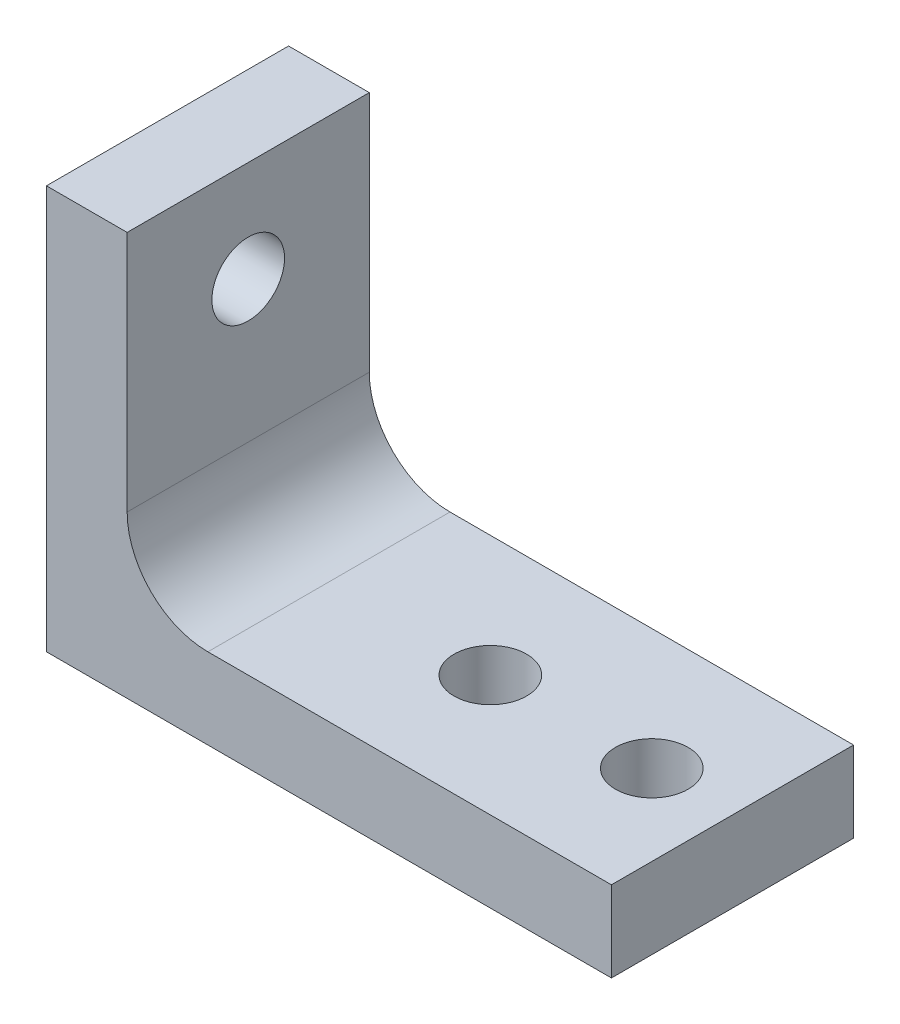
ISO-10303-21;
HEADER;
FILE_DESCRIPTION(('STEP AP214'),'2;1');
FILE_NAME('part.step','',(''),(''),'','','');
FILE_SCHEMA(('AUTOMOTIVE_DESIGN { 1 0 10303 214 1 1 1 1 }'));
ENDSEC;
DATA;
#1=APPLICATION_CONTEXT('core data for automotive mechanical design processes');
#2=APPLICATION_PROTOCOL_DEFINITION('international standard','automotive_design',2000,#1);
#3=PRODUCT_CONTEXT('',#1,'mechanical');
#4=PRODUCT('Part','Part','',(#3));
#5=PRODUCT_RELATED_PRODUCT_CATEGORY('part','',(#4));
#6=PRODUCT_DEFINITION_FORMATION('','',#4);
#7=PRODUCT_DEFINITION_CONTEXT('part definition',#1,'design');
#8=PRODUCT_DEFINITION('design','',#6,#7);
#9=PRODUCT_DEFINITION_SHAPE('','',#8);
#10=(LENGTH_UNIT() NAMED_UNIT(*) SI_UNIT(.MILLI.,.METRE.));
#11=(NAMED_UNIT(*) PLANE_ANGLE_UNIT() SI_UNIT($,.RADIAN.));
#12=(NAMED_UNIT(*) SI_UNIT($,.STERADIAN.) SOLID_ANGLE_UNIT());
#13=UNCERTAINTY_MEASURE_WITH_UNIT(LENGTH_MEASURE(1.E-05),#10,'distance_accuracy_value','');
#14=(GEOMETRIC_REPRESENTATION_CONTEXT(3) GLOBAL_UNCERTAINTY_ASSIGNED_CONTEXT((#13)) GLOBAL_UNIT_ASSIGNED_CONTEXT((#10,
#11,#12)) REPRESENTATION_CONTEXT('',''));
#15=CARTESIAN_POINT('',(0.,0.,0.));
#16=DIRECTION('',(0.,0.,1.));
#17=DIRECTION('',(1.,0.,0.));
#18=AXIS2_PLACEMENT_3D('',#15,#16,#17);
#19=CARTESIAN_POINT('',(60.,0.,30.));
#20=DIRECTION('',(0.,-1.,0.));
#21=DIRECTION('',(1.,0.,0.));
#22=AXIS2_PLACEMENT_3D('',#19,#20,#21);
#23=PLANE('',#22);
#24=CARTESIAN_POINT('',(30.,0.,15.));
#25=DIRECTION('',(0.,1.,0.));
#26=DIRECTION('',(0.,0.,1.));
#27=AXIS2_PLACEMENT_3D('',#24,#25,#26);
#28=CIRCLE('',#27,4.49999999999999);
#29=CARTESIAN_POINT('',(30.,0.,19.5));
#30=VERTEX_POINT('',#29);
#31=EDGE_CURVE('E180',#30,#30,#28,.T.);
#32=ORIENTED_EDGE('',*,*,#31,.F.);
#33=EDGE_LOOP('',(#32));
#34=FACE_BOUND('',#33,.T.);
#35=CARTESIAN_POINT('',(50.,0.,15.));
#36=DIRECTION('',(0.,1.,0.));
#37=DIRECTION('',(0.,0.,1.));
#38=AXIS2_PLACEMENT_3D('',#35,#36,#37);
#39=CIRCLE('',#38,4.49999999999999);
#40=CARTESIAN_POINT('',(50.,0.,19.5));
#41=VERTEX_POINT('',#40);
#42=EDGE_CURVE('E174',#41,#41,#39,.T.);
#43=ORIENTED_EDGE('',*,*,#42,.F.);
#44=EDGE_LOOP('',(#43));
#45=FACE_BOUND('',#44,.T.);
#46=DIRECTION('',(-1.,0.,0.));
#47=VECTOR('',#46,1.);
#48=CARTESIAN_POINT('',(60.,0.,0.));
#49=LINE('',#48,#47);
#50=CARTESIAN_POINT('',(60.,0.,0.));
#51=VERTEX_POINT('',#50);
#52=CARTESIAN_POINT('',(10.,0.,0.));
#53=VERTEX_POINT('',#52);
#54=EDGE_CURVE('E127',#51,#53,#49,.T.);
#55=ORIENTED_EDGE('',*,*,#54,.T.);
#56=DIRECTION('',(0.,0.,-1.));
#57=VECTOR('',#56,1.);
#58=CARTESIAN_POINT('',(10.,0.,30.));
#59=LINE('',#58,#57);
#60=CARTESIAN_POINT('',(10.,0.,30.));
#61=VERTEX_POINT('',#60);
#62=EDGE_CURVE('E50',#53,#61,#59,.F.);
#63=ORIENTED_EDGE('',*,*,#62,.T.);
#64=DIRECTION('',(-1.,0.,0.));
#65=VECTOR('',#64,1.);
#66=CARTESIAN_POINT('',(60.,0.,30.));
#67=LINE('',#66,#65);
#68=CARTESIAN_POINT('',(60.,0.,30.));
#69=VERTEX_POINT('',#68);
#70=EDGE_CURVE('E103',#69,#61,#67,.T.);
#71=ORIENTED_EDGE('',*,*,#70,.F.);
#72=DIRECTION('',(0.,0.,-1.));
#73=VECTOR('',#72,1.);
#74=CARTESIAN_POINT('',(60.,0.,30.));
#75=LINE('',#74,#73);
#76=EDGE_CURVE('E126',#69,#51,#75,.T.);
#77=ORIENTED_EDGE('',*,*,#76,.T.);
#78=EDGE_LOOP('',(#55,#63,#71,#77));
#79=FACE_BOUND('',#78,.T.);
#80=ADVANCED_FACE('F35',(#34,#45,#79),#23,.F.);
#81=CARTESIAN_POINT('',(0.,0.,30.));
#82=DIRECTION('',(-1.,0.,0.));
#83=DIRECTION('',(0.,0.,1.));
#84=AXIS2_PLACEMENT_3D('',#81,#82,#83);
#85=PLANE('',#84);
#86=CARTESIAN_POINT('',(0.,27.5,15.));
#87=DIRECTION('',(1.,0.,0.));
#88=DIRECTION('',(0.,0.,-1.));
#89=AXIS2_PLACEMENT_3D('',#86,#87,#88);
#90=CIRCLE('',#89,4.49999999999999);
#91=CARTESIAN_POINT('',(0.,27.5,10.5));
#92=VERTEX_POINT('',#91);
#93=EDGE_CURVE('E168',#92,#92,#90,.T.);
#94=ORIENTED_EDGE('',*,*,#93,.F.);
#95=EDGE_LOOP('',(#94));
#96=FACE_BOUND('',#95,.T.);
#97=DIRECTION('',(0.,1.,0.));
#98=VECTOR('',#97,1.);
#99=CARTESIAN_POINT('',(0.,0.,30.));
#100=LINE('',#99,#98);
#101=CARTESIAN_POINT('',(0.,10.,30.));
#102=VERTEX_POINT('',#101);
#103=CARTESIAN_POINT('',(0.,40.,30.));
#104=VERTEX_POINT('',#103);
#105=EDGE_CURVE('E93',#102,#104,#100,.T.);
#106=ORIENTED_EDGE('',*,*,#105,.F.);
#107=DIRECTION('',(0.,0.,-1.));
#108=VECTOR('',#107,1.);
#109=CARTESIAN_POINT('',(0.,10.,0.));
#110=LINE('',#109,#108);
#111=CARTESIAN_POINT('',(0.,10.,0.));
#112=VERTEX_POINT('',#111);
#113=EDGE_CURVE('E111',#102,#112,#110,.T.);
#114=ORIENTED_EDGE('',*,*,#113,.T.);
#115=DIRECTION('',(0.,1.,0.));
#116=VECTOR('',#115,1.);
#117=CARTESIAN_POINT('',(0.,0.,0.));
#118=LINE('',#117,#116);
#119=CARTESIAN_POINT('',(0.,40.,0.));
#120=VERTEX_POINT('',#119);
#121=EDGE_CURVE('E108',#112,#120,#118,.T.);
#122=ORIENTED_EDGE('',*,*,#121,.T.);
#123=DIRECTION('',(0.,0.,-1.));
#124=VECTOR('',#123,1.);
#125=CARTESIAN_POINT('',(0.,40.,30.));
#126=LINE('',#125,#124);
#127=EDGE_CURVE('E106',#104,#120,#126,.T.);
#128=ORIENTED_EDGE('',*,*,#127,.F.);
#129=EDGE_LOOP('',(#106,#114,#122,#128));
#130=FACE_BOUND('',#129,.T.);
#131=ADVANCED_FACE('F107',(#96,#130),#85,.F.);
#132=CARTESIAN_POINT('',(0.,40.,30.));
#133=DIRECTION('',(0.,-1.,0.));
#134=DIRECTION('',(1.,0.,0.));
#135=AXIS2_PLACEMENT_3D('',#132,#133,#134);
#136=PLANE('',#135);
#137=DIRECTION('',(-1.,0.,0.));
#138=VECTOR('',#137,1.);
#139=CARTESIAN_POINT('',(0.,40.,0.));
#140=LINE('',#139,#138);
#141=CARTESIAN_POINT('',(-10.,40.,0.));
#142=VERTEX_POINT('',#141);
#143=EDGE_CURVE('E131',#120,#142,#140,.T.);
#144=ORIENTED_EDGE('',*,*,#143,.T.);
#145=DIRECTION('',(0.,0.,-1.));
#146=VECTOR('',#145,1.);
#147=CARTESIAN_POINT('',(-10.,40.,30.));
#148=LINE('',#147,#146);
#149=CARTESIAN_POINT('',(-10.,40.,30.));
#150=VERTEX_POINT('',#149);
#151=EDGE_CURVE('E112',#150,#142,#148,.T.);
#152=ORIENTED_EDGE('',*,*,#151,.F.);
#153=DIRECTION('',(-1.,0.,0.));
#154=VECTOR('',#153,1.);
#155=CARTESIAN_POINT('',(0.,40.,30.));
#156=LINE('',#155,#154);
#157=EDGE_CURVE('E97',#104,#150,#156,.T.);
#158=ORIENTED_EDGE('',*,*,#157,.F.);
#159=ORIENTED_EDGE('',*,*,#127,.T.);
#160=EDGE_LOOP('',(#144,#152,#158,#159));
#161=FACE_BOUND('',#160,.T.);
#162=ADVANCED_FACE('F114',(#161),#136,.F.);
#163=CARTESIAN_POINT('',(-10.,40.,30.));
#164=DIRECTION('',(1.,0.,0.));
#165=DIRECTION('',(0.,1.,0.));
#166=AXIS2_PLACEMENT_3D('',#163,#164,#165);
#167=PLANE('',#166);
#168=CARTESIAN_POINT('',(-10.,27.5,15.));
#169=DIRECTION('',(1.,0.,0.));
#170=DIRECTION('',(0.,0.,-1.));
#171=AXIS2_PLACEMENT_3D('',#168,#169,#170);
#172=CIRCLE('',#171,4.5);
#173=CARTESIAN_POINT('',(-10.,27.5,10.5));
#174=VERTEX_POINT('',#173);
#175=EDGE_CURVE('E129',#174,#174,#172,.T.);
#176=ORIENTED_EDGE('',*,*,#175,.T.);
#177=EDGE_LOOP('',(#176));
#178=FACE_BOUND('',#177,.T.);
#179=DIRECTION('',(0.,-1.,0.));
#180=VECTOR('',#179,1.);
#181=CARTESIAN_POINT('',(-10.,40.,0.));
#182=LINE('',#181,#180);
#183=CARTESIAN_POINT('',(-9.99999999999999,-10.,0.));
#184=VERTEX_POINT('',#183);
#185=EDGE_CURVE('E133',#142,#184,#182,.T.);
#186=ORIENTED_EDGE('',*,*,#185,.T.);
#187=DIRECTION('',(0.,0.,-1.));
#188=VECTOR('',#187,1.);
#189=CARTESIAN_POINT('',(-9.99999999999999,-10.,30.));
#190=LINE('',#189,#188);
#191=CARTESIAN_POINT('',(-9.99999999999999,-10.,30.));
#192=VERTEX_POINT('',#191);
#193=EDGE_CURVE('E145',#192,#184,#190,.T.);
#194=ORIENTED_EDGE('',*,*,#193,.F.);
#195=DIRECTION('',(0.,-1.,0.));
#196=VECTOR('',#195,1.);
#197=CARTESIAN_POINT('',(-10.,40.,30.));
#198=LINE('',#197,#196);
#199=EDGE_CURVE('E117',#150,#192,#198,.T.);
#200=ORIENTED_EDGE('',*,*,#199,.F.);
#201=ORIENTED_EDGE('',*,*,#151,.T.);
#202=EDGE_LOOP('',(#186,#194,#200,#201));
#203=FACE_BOUND('',#202,.T.);
#204=ADVANCED_FACE('F154',(#178,#203),#167,.F.);
#205=CARTESIAN_POINT('',(10.,-10.,30.));
#206=DIRECTION('',(0.,1.,0.));
#207=DIRECTION('',(0.,0.,1.));
#208=AXIS2_PLACEMENT_3D('',#205,#206,#207);
#209=PLANE('',#208);
#210=CARTESIAN_POINT('',(30.,-10.,15.));
#211=DIRECTION('',(0.,1.,0.));
#212=DIRECTION('',(0.,0.,1.));
#213=AXIS2_PLACEMENT_3D('',#210,#211,#212);
#214=CIRCLE('',#213,4.5);
#215=CARTESIAN_POINT('',(30.,-10.,19.5));
#216=VERTEX_POINT('',#215);
#217=EDGE_CURVE('E177',#216,#216,#214,.T.);
#218=ORIENTED_EDGE('',*,*,#217,.T.);
#219=EDGE_LOOP('',(#218));
#220=FACE_BOUND('',#219,.T.);
#221=CARTESIAN_POINT('',(50.,-10.,15.));
#222=DIRECTION('',(0.,1.,0.));
#223=DIRECTION('',(0.,0.,1.));
#224=AXIS2_PLACEMENT_3D('',#221,#222,#223);
#225=CIRCLE('',#224,4.5);
#226=CARTESIAN_POINT('',(50.,-10.,19.5));
#227=VERTEX_POINT('',#226);
#228=EDGE_CURVE('E171',#227,#227,#225,.T.);
#229=ORIENTED_EDGE('',*,*,#228,.T.);
#230=EDGE_LOOP('',(#229));
#231=FACE_BOUND('',#230,.T.);
#232=DIRECTION('',(1.,0.,0.));
#233=VECTOR('',#232,1.);
#234=CARTESIAN_POINT('',(10.,-10.,0.));
#235=LINE('',#234,#233);
#236=CARTESIAN_POINT('',(60.,-10.,0.));
#237=VERTEX_POINT('',#236);
#238=EDGE_CURVE('E136',#184,#237,#235,.T.);
#239=ORIENTED_EDGE('',*,*,#238,.T.);
#240=DIRECTION('',(0.,0.,-1.));
#241=VECTOR('',#240,1.);
#242=CARTESIAN_POINT('',(60.,-10.,30.));
#243=LINE('',#242,#241);
#244=CARTESIAN_POINT('',(60.,-10.,30.));
#245=VERTEX_POINT('',#244);
#246=EDGE_CURVE('E142',#245,#237,#243,.T.);
#247=ORIENTED_EDGE('',*,*,#246,.F.);
#248=DIRECTION('',(1.,0.,0.));
#249=VECTOR('',#248,1.);
#250=CARTESIAN_POINT('',(-9.99999999999999,-10.,30.));
#251=LINE('',#250,#249);
#252=EDGE_CURVE('E119',#192,#245,#251,.T.);
#253=ORIENTED_EDGE('',*,*,#252,.F.);
#254=ORIENTED_EDGE('',*,*,#193,.T.);
#255=EDGE_LOOP('',(#239,#247,#253,#254));
#256=FACE_BOUND('',#255,.T.);
#257=ADVANCED_FACE('F161',(#220,#231,#256),#209,.F.);
#258=CARTESIAN_POINT('',(60.,-10.,30.));
#259=DIRECTION('',(-1.,0.,0.));
#260=DIRECTION('',(0.,0.,1.));
#261=AXIS2_PLACEMENT_3D('',#258,#259,#260);
#262=PLANE('',#261);
#263=DIRECTION('',(0.,1.,0.));
#264=VECTOR('',#263,1.);
#265=CARTESIAN_POINT('',(60.,-10.,0.));
#266=LINE('',#265,#264);
#267=EDGE_CURVE('E138',#237,#51,#266,.T.);
#268=ORIENTED_EDGE('',*,*,#267,.T.);
#269=ORIENTED_EDGE('',*,*,#76,.F.);
#270=DIRECTION('',(0.,1.,0.));
#271=VECTOR('',#270,1.);
#272=CARTESIAN_POINT('',(60.,-10.,30.));
#273=LINE('',#272,#271);
#274=EDGE_CURVE('E124',#245,#69,#273,.T.);
#275=ORIENTED_EDGE('',*,*,#274,.F.);
#276=ORIENTED_EDGE('',*,*,#246,.T.);
#277=EDGE_LOOP('',(#268,#269,#275,#276));
#278=FACE_BOUND('',#277,.T.);
#279=ADVANCED_FACE('F164',(#278),#262,.F.);
#280=CARTESIAN_POINT('',(0.,0.,30.));
#281=DIRECTION('',(0.,0.,-1.));
#282=DIRECTION('',(-1.,0.,0.));
#283=AXIS2_PLACEMENT_3D('',#280,#281,#282);
#284=PLANE('',#283);
#285=ORIENTED_EDGE('',*,*,#70,.T.);
#286=CARTESIAN_POINT('',(10.,10.,30.));
#287=DIRECTION('',(0.,0.,-1.));
#288=DIRECTION('',(-1.,0.,0.));
#289=AXIS2_PLACEMENT_3D('',#286,#287,#288);
#290=CIRCLE('',#289,10.);
#291=EDGE_CURVE('E11',#61,#102,#290,.T.);
#292=ORIENTED_EDGE('',*,*,#291,.T.);
#293=ORIENTED_EDGE('',*,*,#105,.T.);
#294=ORIENTED_EDGE('',*,*,#157,.T.);
#295=ORIENTED_EDGE('',*,*,#199,.T.);
#296=ORIENTED_EDGE('',*,*,#252,.T.);
#297=ORIENTED_EDGE('',*,*,#274,.T.);
#298=EDGE_LOOP('',(#285,#292,#293,#294,#295,#296,#297));
#299=FACE_BOUND('',#298,.T.);
#300=ADVANCED_FACE('F95',(#299),#284,.F.);
#301=CARTESIAN_POINT('',(0.,0.,0.));
#302=DIRECTION('',(0.,0.,-1.));
#303=DIRECTION('',(-1.,0.,0.));
#304=AXIS2_PLACEMENT_3D('',#301,#302,#303);
#305=PLANE('',#304);
#306=ORIENTED_EDGE('',*,*,#54,.F.);
#307=ORIENTED_EDGE('',*,*,#267,.F.);
#308=ORIENTED_EDGE('',*,*,#238,.F.);
#309=ORIENTED_EDGE('',*,*,#185,.F.);
#310=ORIENTED_EDGE('',*,*,#143,.F.);
#311=ORIENTED_EDGE('',*,*,#121,.F.);
#312=CARTESIAN_POINT('',(10.,10.,0.));
#313=DIRECTION('',(0.,0.,-1.));
#314=DIRECTION('',(-1.,0.,0.));
#315=AXIS2_PLACEMENT_3D('',#312,#313,#314);
#316=CIRCLE('',#315,10.);
#317=EDGE_CURVE('E43',#112,#53,#316,.F.);
#318=ORIENTED_EDGE('',*,*,#317,.T.);
#319=EDGE_LOOP('',(#306,#307,#308,#309,#310,#311,#318));
#320=FACE_BOUND('',#319,.T.);
#321=ADVANCED_FACE('F151',(#320),#305,.T.);
#322=CARTESIAN_POINT('',(0.,27.5,15.));
#323=DIRECTION('',(1.,0.,0.));
#324=DIRECTION('',(0.,0.,-1.));
#325=AXIS2_PLACEMENT_3D('',#322,#323,#324);
#326=CYLINDRICAL_SURFACE('',#325,4.49999999999999);
#327=ORIENTED_EDGE('',*,*,#175,.F.);
#328=EDGE_LOOP('',(#327));
#329=FACE_BOUND('',#328,.T.);
#330=ORIENTED_EDGE('',*,*,#93,.T.);
#331=EDGE_LOOP('',(#330));
#332=FACE_BOUND('',#331,.T.);
#333=ADVANCED_FACE('F192',(#329,#332),#326,.F.);
#334=CARTESIAN_POINT('',(50.,0.,15.));
#335=DIRECTION('',(0.,1.,0.));
#336=DIRECTION('',(0.,0.,1.));
#337=AXIS2_PLACEMENT_3D('',#334,#335,#336);
#338=CYLINDRICAL_SURFACE('',#337,4.49999999999999);
#339=ORIENTED_EDGE('',*,*,#228,.F.);
#340=EDGE_LOOP('',(#339));
#341=FACE_BOUND('',#340,.T.);
#342=ORIENTED_EDGE('',*,*,#42,.T.);
#343=EDGE_LOOP('',(#342));
#344=FACE_BOUND('',#343,.T.);
#345=ADVANCED_FACE('F190',(#341,#344),#338,.F.);
#346=CARTESIAN_POINT('',(30.,0.,15.));
#347=DIRECTION('',(0.,1.,0.));
#348=DIRECTION('',(0.,0.,1.));
#349=AXIS2_PLACEMENT_3D('',#346,#347,#348);
#350=CYLINDRICAL_SURFACE('',#349,4.49999999999999);
#351=ORIENTED_EDGE('',*,*,#217,.F.);
#352=EDGE_LOOP('',(#351));
#353=FACE_BOUND('',#352,.T.);
#354=ORIENTED_EDGE('',*,*,#31,.T.);
#355=EDGE_LOOP('',(#354));
#356=FACE_BOUND('',#355,.T.);
#357=ADVANCED_FACE('F184',(#353,#356),#350,.F.);
#358=CARTESIAN_POINT('',(10.,10.,30.));
#359=DIRECTION('',(0.,0.,1.));
#360=DIRECTION('',(1.,0.,0.));
#361=AXIS2_PLACEMENT_3D('',#358,#359,#360);
#362=CYLINDRICAL_SURFACE('',#361,10.);
#363=ORIENTED_EDGE('',*,*,#291,.F.);
#364=ORIENTED_EDGE('',*,*,#62,.F.);
#365=ORIENTED_EDGE('',*,*,#317,.F.);
#366=ORIENTED_EDGE('',*,*,#113,.F.);
#367=EDGE_LOOP('',(#363,#364,#365,#366));
#368=FACE_BOUND('',#367,.T.);
#369=ADVANCED_FACE('F37',(#368),#362,.F.);
#370=CLOSED_SHELL('',(#80,#131,#162,#204,#257,#279,#300,#321,#333,#345,#357,#369));
#371=MANIFOLD_SOLID_BREP('B2',#370);
#372=ADVANCED_BREP_SHAPE_REPRESENTATION('',(#18,#371),#14);
#373=SHAPE_DEFINITION_REPRESENTATION(#9,#372);
ENDSEC;
END-ISO-10303-21;
